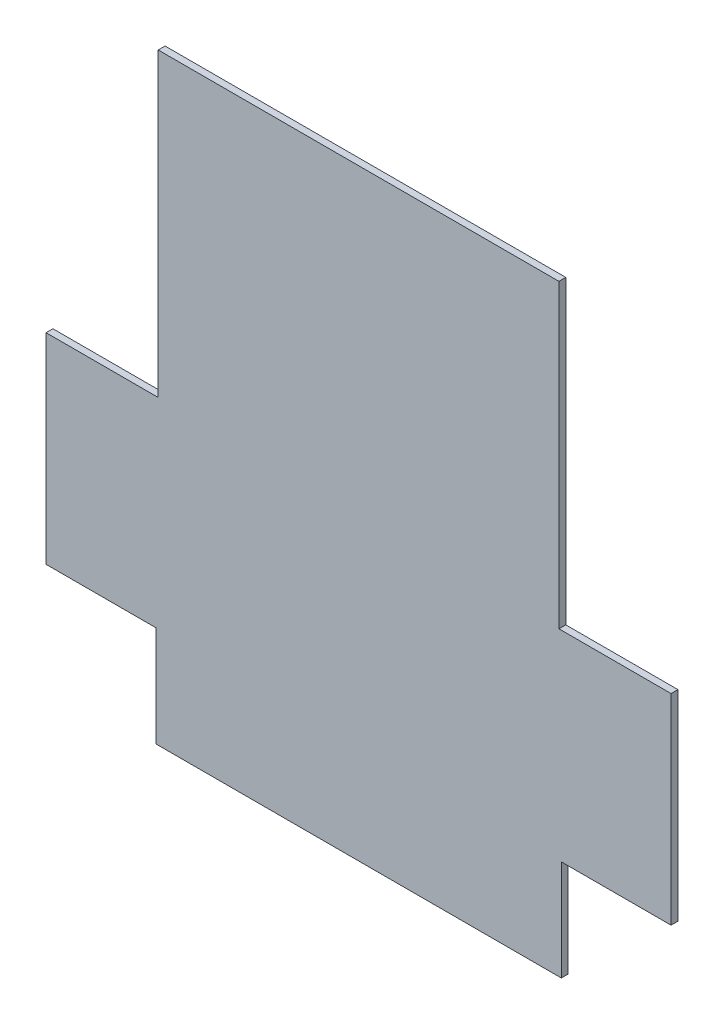
ISO-10303-21;
HEADER;
FILE_DESCRIPTION(('STEP AP214'),'2;1');
FILE_NAME('part.step','',(''),(''),'','','');
FILE_SCHEMA(('AUTOMOTIVE_DESIGN { 1 0 10303 214 1 1 1 1 }'));
ENDSEC;
DATA;
#1=APPLICATION_CONTEXT('core data for automotive mechanical design processes');
#2=APPLICATION_PROTOCOL_DEFINITION('international standard','automotive_design',2000,#1);
#3=PRODUCT_CONTEXT('',#1,'mechanical');
#4=PRODUCT('Part','Part','',(#3));
#5=PRODUCT_RELATED_PRODUCT_CATEGORY('part','',(#4));
#6=PRODUCT_DEFINITION_FORMATION('','',#4);
#7=PRODUCT_DEFINITION_CONTEXT('part definition',#1,'design');
#8=PRODUCT_DEFINITION('design','',#6,#7);
#9=PRODUCT_DEFINITION_SHAPE('','',#8);
#10=(LENGTH_UNIT() NAMED_UNIT(*) SI_UNIT(.MILLI.,.METRE.));
#11=(NAMED_UNIT(*) PLANE_ANGLE_UNIT() SI_UNIT($,.RADIAN.));
#12=(NAMED_UNIT(*) SI_UNIT($,.STERADIAN.) SOLID_ANGLE_UNIT());
#13=UNCERTAINTY_MEASURE_WITH_UNIT(LENGTH_MEASURE(1.E-05),#10,'distance_accuracy_value','');
#14=(GEOMETRIC_REPRESENTATION_CONTEXT(3) GLOBAL_UNCERTAINTY_ASSIGNED_CONTEXT((#13)) GLOBAL_UNIT_ASSIGNED_CONTEXT((#10,
#11,#12)) REPRESENTATION_CONTEXT('',''));
#15=CARTESIAN_POINT('',(0.,0.,0.));
#16=DIRECTION('',(0.,0.,1.));
#17=DIRECTION('',(1.,0.,0.));
#18=AXIS2_PLACEMENT_3D('',#15,#16,#17);
#19=CARTESIAN_POINT('',(0.,0.,3.));
#20=DIRECTION('',(1.,0.,0.));
#21=DIRECTION('',(0.,1.,0.));
#22=AXIS2_PLACEMENT_3D('',#19,#20,#21);
#23=PLANE('',#22);
#24=DIRECTION('',(0.,-1.,0.));
#25=VECTOR('',#24,1.);
#26=CARTESIAN_POINT('',(0.,0.,0.));
#27=LINE('',#26,#25);
#28=CARTESIAN_POINT('',(0.,-131.64,0.));
#29=VERTEX_POINT('',#28);
#30=CARTESIAN_POINT('',(0.,-219.4,0.));
#31=VERTEX_POINT('',#30);
#32=EDGE_CURVE('E151',#29,#31,#27,.T.);
#33=ORIENTED_EDGE('',*,*,#32,.T.);
#34=DIRECTION('',(0.,0.,1.));
#35=VECTOR('',#34,1.);
#36=CARTESIAN_POINT('',(0.,-219.4,0.));
#37=LINE('',#36,#35);
#38=CARTESIAN_POINT('',(0.,-219.4,3.));
#39=VERTEX_POINT('',#38);
#40=EDGE_CURVE('E176',#31,#39,#37,.T.);
#41=ORIENTED_EDGE('',*,*,#40,.T.);
#42=DIRECTION('',(0.,-1.,0.));
#43=VECTOR('',#42,1.);
#44=CARTESIAN_POINT('',(0.,0.,3.));
#45=LINE('',#44,#43);
#46=CARTESIAN_POINT('',(0.,-131.64,3.));
#47=VERTEX_POINT('',#46);
#48=EDGE_CURVE('E149',#47,#39,#45,.T.);
#49=ORIENTED_EDGE('',*,*,#48,.F.);
#50=DIRECTION('',(0.,0.,1.));
#51=VECTOR('',#50,1.);
#52=CARTESIAN_POINT('',(0.,-131.64,0.));
#53=LINE('',#52,#51);
#54=EDGE_CURVE('E163',#29,#47,#53,.T.);
#55=ORIENTED_EDGE('',*,*,#54,.F.);
#56=EDGE_LOOP('',(#33,#41,#49,#55));
#57=FACE_BOUND('',#56,.T.);
#58=ADVANCED_FACE('F33',(#57),#23,.F.);
#59=CARTESIAN_POINT('',(0.,-263.4,3.));
#60=DIRECTION('',(0.,1.,0.));
#61=DIRECTION('',(0.,0.,1.));
#62=AXIS2_PLACEMENT_3D('',#59,#60,#61);
#63=PLANE('',#62);
#64=DIRECTION('',(1.,0.,0.));
#65=VECTOR('',#64,1.);
#66=CARTESIAN_POINT('',(0.,-263.4,3.));
#67=LINE('',#66,#65);
#68=CARTESIAN_POINT('',(48.,-263.4,3.));
#69=VERTEX_POINT('',#68);
#70=CARTESIAN_POINT('',(225.4,-263.4,3.));
#71=VERTEX_POINT('',#70);
#72=EDGE_CURVE('E158',#69,#71,#67,.T.);
#73=ORIENTED_EDGE('',*,*,#72,.F.);
#74=DIRECTION('',(0.,0.,1.));
#75=VECTOR('',#74,1.);
#76=CARTESIAN_POINT('',(48.,-263.4,0.));
#77=LINE('',#76,#75);
#78=CARTESIAN_POINT('',(48.,-263.4,0.));
#79=VERTEX_POINT('',#78);
#80=EDGE_CURVE('E197',#79,#69,#77,.T.);
#81=ORIENTED_EDGE('',*,*,#80,.F.);
#82=DIRECTION('',(1.,0.,0.));
#83=VECTOR('',#82,1.);
#84=CARTESIAN_POINT('',(0.,-263.4,0.));
#85=LINE('',#84,#83);
#86=CARTESIAN_POINT('',(225.4,-263.4,0.));
#87=VERTEX_POINT('',#86);
#88=EDGE_CURVE('E147',#79,#87,#85,.T.);
#89=ORIENTED_EDGE('',*,*,#88,.T.);
#90=DIRECTION('',(0.,0.,1.));
#91=VECTOR('',#90,1.);
#92=CARTESIAN_POINT('',(225.4,-263.4,0.));
#93=LINE('',#92,#91);
#94=EDGE_CURVE('E194',#87,#71,#93,.T.);
#95=ORIENTED_EDGE('',*,*,#94,.T.);
#96=EDGE_LOOP('',(#73,#81,#89,#95));
#97=FACE_BOUND('',#96,.T.);
#98=ADVANCED_FACE('F221',(#97),#63,.F.);
#99=CARTESIAN_POINT('',(273.4,0.,3.));
#100=DIRECTION('',(-1.,0.,0.));
#101=DIRECTION('',(0.,-1.,0.));
#102=AXIS2_PLACEMENT_3D('',#99,#100,#101);
#103=PLANE('',#102);
#104=DIRECTION('',(0.,1.,0.));
#105=VECTOR('',#104,1.);
#106=CARTESIAN_POINT('',(273.4,0.,0.));
#107=LINE('',#106,#105);
#108=CARTESIAN_POINT('',(273.4,-219.4,0.));
#109=VERTEX_POINT('',#108);
#110=CARTESIAN_POINT('',(273.4,-131.64,0.));
#111=VERTEX_POINT('',#110);
#112=EDGE_CURVE('E141',#109,#111,#107,.T.);
#113=ORIENTED_EDGE('',*,*,#112,.T.);
#114=DIRECTION('',(0.,0.,1.));
#115=VECTOR('',#114,1.);
#116=CARTESIAN_POINT('',(273.4,-131.64,0.));
#117=LINE('',#116,#115);
#118=CARTESIAN_POINT('',(273.4,-131.64,3.));
#119=VERTEX_POINT('',#118);
#120=EDGE_CURVE('E185',#111,#119,#117,.T.);
#121=ORIENTED_EDGE('',*,*,#120,.T.);
#122=DIRECTION('',(0.,1.,0.));
#123=VECTOR('',#122,1.);
#124=CARTESIAN_POINT('',(273.4,0.,3.));
#125=LINE('',#124,#123);
#126=CARTESIAN_POINT('',(273.4,-219.4,3.));
#127=VERTEX_POINT('',#126);
#128=EDGE_CURVE('E41',#127,#119,#125,.T.);
#129=ORIENTED_EDGE('',*,*,#128,.F.);
#130=DIRECTION('',(0.,0.,1.));
#131=VECTOR('',#130,1.);
#132=CARTESIAN_POINT('',(273.4,-219.4,0.));
#133=LINE('',#132,#131);
#134=EDGE_CURVE('E127',#109,#127,#133,.T.);
#135=ORIENTED_EDGE('',*,*,#134,.F.);
#136=EDGE_LOOP('',(#113,#121,#129,#135));
#137=FACE_BOUND('',#136,.T.);
#138=ADVANCED_FACE('F139',(#137),#103,.F.);
#139=CARTESIAN_POINT('',(0.,0.,3.));
#140=DIRECTION('',(0.,-1.,0.));
#141=DIRECTION('',(0.,0.,-1.));
#142=AXIS2_PLACEMENT_3D('',#139,#140,#141);
#143=PLANE('',#142);
#144=DIRECTION('',(-1.,0.,0.));
#145=VECTOR('',#144,1.);
#146=CARTESIAN_POINT('',(0.,0.,3.));
#147=LINE('',#146,#145);
#148=CARTESIAN_POINT('',(224.35,0.,3.));
#149=VERTEX_POINT('',#148);
#150=CARTESIAN_POINT('',(49.05,0.,3.));
#151=VERTEX_POINT('',#150);
#152=EDGE_CURVE('E11',#149,#151,#147,.T.);
#153=ORIENTED_EDGE('',*,*,#152,.F.);
#154=DIRECTION('',(0.,0.,1.));
#155=VECTOR('',#154,1.);
#156=CARTESIAN_POINT('',(224.35,0.,0.));
#157=LINE('',#156,#155);
#158=CARTESIAN_POINT('',(224.35,0.,0.));
#159=VERTEX_POINT('',#158);
#160=EDGE_CURVE('E181',#159,#149,#157,.T.);
#161=ORIENTED_EDGE('',*,*,#160,.F.);
#162=DIRECTION('',(-1.,0.,0.));
#163=VECTOR('',#162,1.);
#164=CARTESIAN_POINT('',(0.,0.,0.));
#165=LINE('',#164,#163);
#166=CARTESIAN_POINT('',(49.05,0.,0.));
#167=VERTEX_POINT('',#166);
#168=EDGE_CURVE('E36',#159,#167,#165,.T.);
#169=ORIENTED_EDGE('',*,*,#168,.T.);
#170=DIRECTION('',(0.,0.,1.));
#171=VECTOR('',#170,1.);
#172=CARTESIAN_POINT('',(49.05,0.,0.));
#173=LINE('',#172,#171);
#174=EDGE_CURVE('E155',#167,#151,#173,.T.);
#175=ORIENTED_EDGE('',*,*,#174,.T.);
#176=EDGE_LOOP('',(#153,#161,#169,#175));
#177=FACE_BOUND('',#176,.T.);
#178=ADVANCED_FACE('F244',(#177),#143,.F.);
#179=CARTESIAN_POINT('',(0.,0.,3.));
#180=DIRECTION('',(0.,0.,1.));
#181=DIRECTION('',(1.,0.,0.));
#182=AXIS2_PLACEMENT_3D('',#179,#180,#181);
#183=PLANE('',#182);
#184=DIRECTION('',(-1.,0.,0.));
#185=VECTOR('',#184,1.);
#186=CARTESIAN_POINT('',(0.,-219.4,3.));
#187=LINE('',#186,#185);
#188=CARTESIAN_POINT('',(48.,-219.4,3.));
#189=VERTEX_POINT('',#188);
#190=EDGE_CURVE('E203',#189,#39,#187,.T.);
#191=ORIENTED_EDGE('',*,*,#190,.F.);
#192=DIRECTION('',(0.,1.,0.));
#193=VECTOR('',#192,1.);
#194=CARTESIAN_POINT('',(48.,-263.4,3.));
#195=LINE('',#194,#193);
#196=EDGE_CURVE('E187',#69,#189,#195,.T.);
#197=ORIENTED_EDGE('',*,*,#196,.F.);
#198=ORIENTED_EDGE('',*,*,#72,.T.);
#199=DIRECTION('',(0.,-1.,0.));
#200=VECTOR('',#199,1.);
#201=CARTESIAN_POINT('',(225.4,-263.4,3.));
#202=LINE('',#201,#200);
#203=CARTESIAN_POINT('',(225.4,-219.4,3.));
#204=VERTEX_POINT('',#203);
#205=EDGE_CURVE('E134',#204,#71,#202,.T.);
#206=ORIENTED_EDGE('',*,*,#205,.F.);
#207=DIRECTION('',(-1.,0.,0.));
#208=VECTOR('',#207,1.);
#209=CARTESIAN_POINT('',(273.4,-219.4,3.));
#210=LINE('',#209,#208);
#211=EDGE_CURVE('E214',#127,#204,#210,.T.);
#212=ORIENTED_EDGE('',*,*,#211,.F.);
#213=ORIENTED_EDGE('',*,*,#128,.T.);
#214=DIRECTION('',(1.,0.,0.));
#215=VECTOR('',#214,1.);
#216=CARTESIAN_POINT('',(273.4,-131.64,3.));
#217=LINE('',#216,#215);
#218=CARTESIAN_POINT('',(224.35,-131.64,3.));
#219=VERTEX_POINT('',#218);
#220=EDGE_CURVE('E188',#219,#119,#217,.T.);
#221=ORIENTED_EDGE('',*,*,#220,.F.);
#222=DIRECTION('',(0.,-1.,0.));
#223=VECTOR('',#222,1.);
#224=CARTESIAN_POINT('',(224.35,0.,3.));
#225=LINE('',#224,#223);
#226=EDGE_CURVE('E191',#149,#219,#225,.T.);
#227=ORIENTED_EDGE('',*,*,#226,.F.);
#228=ORIENTED_EDGE('',*,*,#152,.T.);
#229=DIRECTION('',(0.,1.,0.));
#230=VECTOR('',#229,1.);
#231=CARTESIAN_POINT('',(49.05,0.,3.));
#232=LINE('',#231,#230);
#233=CARTESIAN_POINT('',(49.05,-131.64,3.));
#234=VERTEX_POINT('',#233);
#235=EDGE_CURVE('E170',#234,#151,#232,.T.);
#236=ORIENTED_EDGE('',*,*,#235,.F.);
#237=DIRECTION('',(1.,0.,0.));
#238=VECTOR('',#237,1.);
#239=CARTESIAN_POINT('',(0.,-131.64,3.));
#240=LINE('',#239,#238);
#241=EDGE_CURVE('E173',#47,#234,#240,.T.);
#242=ORIENTED_EDGE('',*,*,#241,.F.);
#243=ORIENTED_EDGE('',*,*,#48,.T.);
#244=EDGE_LOOP('',(#191,#197,#198,#206,#212,#213,#221,#227,#228,#236,#242,#243));
#245=FACE_BOUND('',#244,.T.);
#246=ADVANCED_FACE('F227',(#245),#183,.T.);
#247=CARTESIAN_POINT('',(0.,0.,0.));
#248=DIRECTION('',(0.,0.,1.));
#249=DIRECTION('',(1.,0.,0.));
#250=AXIS2_PLACEMENT_3D('',#247,#248,#249);
#251=PLANE('',#250);
#252=DIRECTION('',(0.,1.,0.));
#253=VECTOR('',#252,1.);
#254=CARTESIAN_POINT('',(48.,-263.4,0.));
#255=LINE('',#254,#253);
#256=CARTESIAN_POINT('',(48.,-219.4,0.));
#257=VERTEX_POINT('',#256);
#258=EDGE_CURVE('E205',#79,#257,#255,.T.);
#259=ORIENTED_EDGE('',*,*,#258,.T.);
#260=DIRECTION('',(-1.,0.,0.));
#261=VECTOR('',#260,1.);
#262=CARTESIAN_POINT('',(0.,-219.4,0.));
#263=LINE('',#262,#261);
#264=EDGE_CURVE('E49',#257,#31,#263,.T.);
#265=ORIENTED_EDGE('',*,*,#264,.T.);
#266=ORIENTED_EDGE('',*,*,#32,.F.);
#267=DIRECTION('',(1.,0.,0.));
#268=VECTOR('',#267,1.);
#269=CARTESIAN_POINT('',(0.,-131.64,0.));
#270=LINE('',#269,#268);
#271=CARTESIAN_POINT('',(49.05,-131.64,0.));
#272=VERTEX_POINT('',#271);
#273=EDGE_CURVE('E172',#29,#272,#270,.T.);
#274=ORIENTED_EDGE('',*,*,#273,.T.);
#275=DIRECTION('',(0.,1.,0.));
#276=VECTOR('',#275,1.);
#277=CARTESIAN_POINT('',(49.05,0.,0.));
#278=LINE('',#277,#276);
#279=EDGE_CURVE('E166',#272,#167,#278,.T.);
#280=ORIENTED_EDGE('',*,*,#279,.T.);
#281=ORIENTED_EDGE('',*,*,#168,.F.);
#282=DIRECTION('',(0.,-1.,0.));
#283=VECTOR('',#282,1.);
#284=CARTESIAN_POINT('',(224.35,0.,0.));
#285=LINE('',#284,#283);
#286=CARTESIAN_POINT('',(224.35,-131.64,0.));
#287=VERTEX_POINT('',#286);
#288=EDGE_CURVE('E190',#159,#287,#285,.T.);
#289=ORIENTED_EDGE('',*,*,#288,.T.);
#290=DIRECTION('',(1.,0.,0.));
#291=VECTOR('',#290,1.);
#292=CARTESIAN_POINT('',(273.4,-131.64,0.));
#293=LINE('',#292,#291);
#294=EDGE_CURVE('E57',#287,#111,#293,.T.);
#295=ORIENTED_EDGE('',*,*,#294,.T.);
#296=ORIENTED_EDGE('',*,*,#112,.F.);
#297=DIRECTION('',(-1.,0.,0.));
#298=VECTOR('',#297,1.);
#299=CARTESIAN_POINT('',(273.4,-219.4,0.));
#300=LINE('',#299,#298);
#301=CARTESIAN_POINT('',(225.4,-219.4,0.));
#302=VERTEX_POINT('',#301);
#303=EDGE_CURVE('E123',#109,#302,#300,.T.);
#304=ORIENTED_EDGE('',*,*,#303,.T.);
#305=DIRECTION('',(0.,-1.,0.));
#306=VECTOR('',#305,1.);
#307=CARTESIAN_POINT('',(225.4,-263.4,0.));
#308=LINE('',#307,#306);
#309=EDGE_CURVE('E133',#302,#87,#308,.T.);
#310=ORIENTED_EDGE('',*,*,#309,.T.);
#311=ORIENTED_EDGE('',*,*,#88,.F.);
#312=EDGE_LOOP('',(#259,#265,#266,#274,#280,#281,#289,#295,#296,#304,#310,#311));
#313=FACE_BOUND('',#312,.T.);
#314=ADVANCED_FACE('F145',(#313),#251,.F.);
#315=CARTESIAN_POINT('',(49.05,0.,0.));
#316=DIRECTION('',(1.,0.,0.));
#317=DIRECTION('',(0.,1.,0.));
#318=AXIS2_PLACEMENT_3D('',#315,#316,#317);
#319=PLANE('',#318);
#320=ORIENTED_EDGE('',*,*,#235,.T.);
#321=ORIENTED_EDGE('',*,*,#174,.F.);
#322=ORIENTED_EDGE('',*,*,#279,.F.);
#323=DIRECTION('',(0.,0.,1.));
#324=VECTOR('',#323,1.);
#325=CARTESIAN_POINT('',(49.05,-131.64,0.));
#326=LINE('',#325,#324);
#327=EDGE_CURVE('E165',#272,#234,#326,.T.);
#328=ORIENTED_EDGE('',*,*,#327,.T.);
#329=EDGE_LOOP('',(#320,#321,#322,#328));
#330=FACE_BOUND('',#329,.T.);
#331=ADVANCED_FACE('F241',(#330),#319,.F.);
#332=CARTESIAN_POINT('',(0.,-131.64,0.));
#333=DIRECTION('',(0.,-1.,0.));
#334=DIRECTION('',(0.,0.,-1.));
#335=AXIS2_PLACEMENT_3D('',#332,#333,#334);
#336=PLANE('',#335);
#337=ORIENTED_EDGE('',*,*,#241,.T.);
#338=ORIENTED_EDGE('',*,*,#327,.F.);
#339=ORIENTED_EDGE('',*,*,#273,.F.);
#340=ORIENTED_EDGE('',*,*,#54,.T.);
#341=EDGE_LOOP('',(#337,#338,#339,#340));
#342=FACE_BOUND('',#341,.T.);
#343=ADVANCED_FACE('F238',(#342),#336,.F.);
#344=CARTESIAN_POINT('',(225.4,-263.4,0.));
#345=DIRECTION('',(-1.,0.,0.));
#346=DIRECTION('',(0.,0.,1.));
#347=AXIS2_PLACEMENT_3D('',#344,#345,#346);
#348=PLANE('',#347);
#349=ORIENTED_EDGE('',*,*,#205,.T.);
#350=ORIENTED_EDGE('',*,*,#94,.F.);
#351=ORIENTED_EDGE('',*,*,#309,.F.);
#352=DIRECTION('',(0.,0.,1.));
#353=VECTOR('',#352,1.);
#354=CARTESIAN_POINT('',(225.4,-219.4,0.));
#355=LINE('',#354,#353);
#356=EDGE_CURVE('E129',#302,#204,#355,.T.);
#357=ORIENTED_EDGE('',*,*,#356,.T.);
#358=EDGE_LOOP('',(#349,#350,#351,#357));
#359=FACE_BOUND('',#358,.T.);
#360=ADVANCED_FACE('F251',(#359),#348,.F.);
#361=CARTESIAN_POINT('',(273.4,-219.4,0.));
#362=DIRECTION('',(0.,1.,0.));
#363=DIRECTION('',(0.,0.,1.));
#364=AXIS2_PLACEMENT_3D('',#361,#362,#363);
#365=PLANE('',#364);
#366=ORIENTED_EDGE('',*,*,#211,.T.);
#367=ORIENTED_EDGE('',*,*,#356,.F.);
#368=ORIENTED_EDGE('',*,*,#303,.F.);
#369=ORIENTED_EDGE('',*,*,#134,.T.);
#370=EDGE_LOOP('',(#366,#367,#368,#369));
#371=FACE_BOUND('',#370,.T.);
#372=ADVANCED_FACE('F126',(#371),#365,.F.);
#373=CARTESIAN_POINT('',(273.4,-131.64,0.));
#374=DIRECTION('',(0.,-1.,0.));
#375=DIRECTION('',(0.,0.,-1.));
#376=AXIS2_PLACEMENT_3D('',#373,#374,#375);
#377=PLANE('',#376);
#378=ORIENTED_EDGE('',*,*,#220,.T.);
#379=ORIENTED_EDGE('',*,*,#120,.F.);
#380=ORIENTED_EDGE('',*,*,#294,.F.);
#381=DIRECTION('',(0.,0.,1.));
#382=VECTOR('',#381,1.);
#383=CARTESIAN_POINT('',(224.35,-131.64,0.));
#384=LINE('',#383,#382);
#385=EDGE_CURVE('E183',#287,#219,#384,.T.);
#386=ORIENTED_EDGE('',*,*,#385,.T.);
#387=EDGE_LOOP('',(#378,#379,#380,#386));
#388=FACE_BOUND('',#387,.T.);
#389=ADVANCED_FACE('F250',(#388),#377,.F.);
#390=CARTESIAN_POINT('',(224.35,0.,0.));
#391=DIRECTION('',(-1.,0.,0.));
#392=DIRECTION('',(0.,-1.,0.));
#393=AXIS2_PLACEMENT_3D('',#390,#391,#392);
#394=PLANE('',#393);
#395=ORIENTED_EDGE('',*,*,#226,.T.);
#396=ORIENTED_EDGE('',*,*,#385,.F.);
#397=ORIENTED_EDGE('',*,*,#288,.F.);
#398=ORIENTED_EDGE('',*,*,#160,.T.);
#399=EDGE_LOOP('',(#395,#396,#397,#398));
#400=FACE_BOUND('',#399,.T.);
#401=ADVANCED_FACE('F249',(#400),#394,.F.);
#402=CARTESIAN_POINT('',(0.,-219.4,0.));
#403=DIRECTION('',(0.,1.,0.));
#404=DIRECTION('',(0.,0.,1.));
#405=AXIS2_PLACEMENT_3D('',#402,#403,#404);
#406=PLANE('',#405);
#407=ORIENTED_EDGE('',*,*,#190,.T.);
#408=ORIENTED_EDGE('',*,*,#40,.F.);
#409=ORIENTED_EDGE('',*,*,#264,.F.);
#410=DIRECTION('',(0.,0.,1.));
#411=VECTOR('',#410,1.);
#412=CARTESIAN_POINT('',(48.,-219.4,0.));
#413=LINE('',#412,#411);
#414=EDGE_CURVE('E199',#257,#189,#413,.T.);
#415=ORIENTED_EDGE('',*,*,#414,.T.);
#416=EDGE_LOOP('',(#407,#408,#409,#415));
#417=FACE_BOUND('',#416,.T.);
#418=ADVANCED_FACE('F231',(#417),#406,.F.);
#419=CARTESIAN_POINT('',(48.,-263.4,0.));
#420=DIRECTION('',(1.,0.,0.));
#421=DIRECTION('',(0.,0.,-1.));
#422=AXIS2_PLACEMENT_3D('',#419,#420,#421);
#423=PLANE('',#422);
#424=ORIENTED_EDGE('',*,*,#196,.T.);
#425=ORIENTED_EDGE('',*,*,#414,.F.);
#426=ORIENTED_EDGE('',*,*,#258,.F.);
#427=ORIENTED_EDGE('',*,*,#80,.T.);
#428=EDGE_LOOP('',(#424,#425,#426,#427));
#429=FACE_BOUND('',#428,.T.);
#430=ADVANCED_FACE('F224',(#429),#423,.F.);
#431=CLOSED_SHELL('',(#58,#98,#138,#178,#246,#314,#331,#343,#360,#372,#389,#401,#418,#430));
#432=MANIFOLD_SOLID_BREP('B2',#431);
#433=ADVANCED_BREP_SHAPE_REPRESENTATION('',(#18,#432),#14);
#434=SHAPE_DEFINITION_REPRESENTATION(#9,#433);
ENDSEC;
END-ISO-10303-21;
